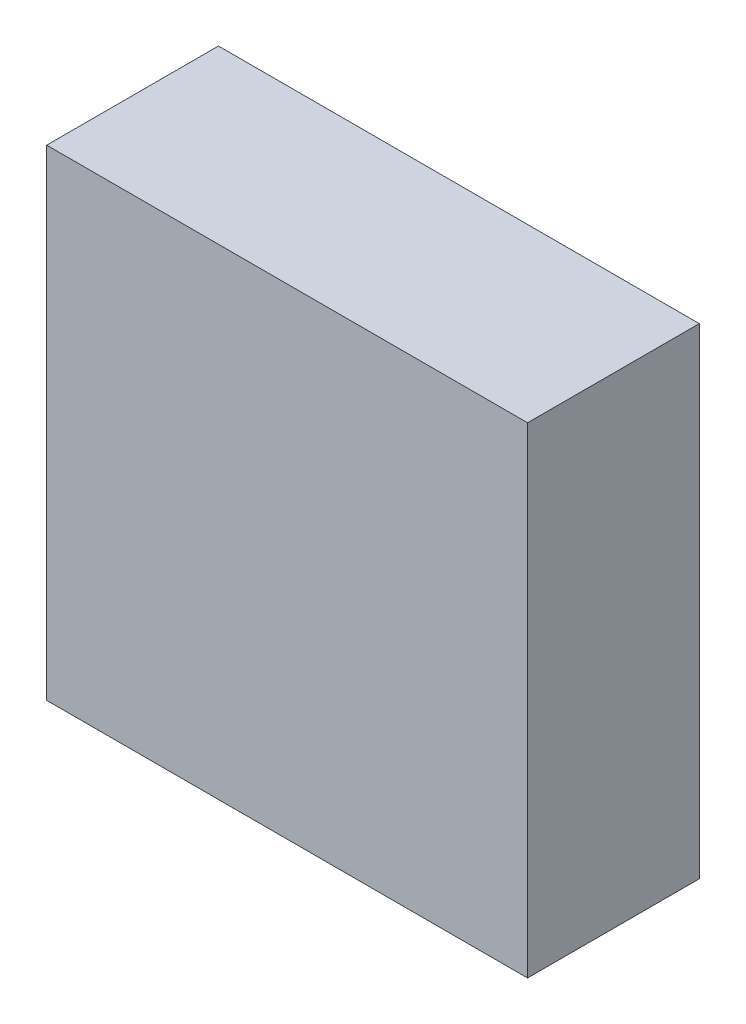
ISO-10303-21;
HEADER;
FILE_DESCRIPTION(('STEP AP214'),'2;1');
FILE_NAME('part.step','',(''),(''),'','','');
FILE_SCHEMA(('AUTOMOTIVE_DESIGN { 1 0 10303 214 1 1 1 1 }'));
ENDSEC;
DATA;
#1=APPLICATION_CONTEXT('core data for automotive mechanical design processes');
#2=APPLICATION_PROTOCOL_DEFINITION('international standard','automotive_design',2000,#1);
#3=PRODUCT_CONTEXT('',#1,'mechanical');
#4=PRODUCT('Part','Part','',(#3));
#5=PRODUCT_RELATED_PRODUCT_CATEGORY('part','',(#4));
#6=PRODUCT_DEFINITION_FORMATION('','',#4);
#7=PRODUCT_DEFINITION_CONTEXT('part definition',#1,'design');
#8=PRODUCT_DEFINITION('design','',#6,#7);
#9=PRODUCT_DEFINITION_SHAPE('','',#8);
#10=(LENGTH_UNIT() NAMED_UNIT(*) SI_UNIT(.MILLI.,.METRE.));
#11=(NAMED_UNIT(*) PLANE_ANGLE_UNIT() SI_UNIT($,.RADIAN.));
#12=(NAMED_UNIT(*) SI_UNIT($,.STERADIAN.) SOLID_ANGLE_UNIT());
#13=UNCERTAINTY_MEASURE_WITH_UNIT(LENGTH_MEASURE(1.E-05),#10,'distance_accuracy_value','');
#14=(GEOMETRIC_REPRESENTATION_CONTEXT(3) GLOBAL_UNCERTAINTY_ASSIGNED_CONTEXT((#13)) GLOBAL_UNIT_ASSIGNED_CONTEXT((#10,
#11,#12)) REPRESENTATION_CONTEXT('',''));
#15=CARTESIAN_POINT('',(0.,0.,0.));
#16=DIRECTION('',(0.,0.,1.));
#17=DIRECTION('',(1.,0.,0.));
#18=AXIS2_PLACEMENT_3D('',#15,#16,#17);
#19=CARTESIAN_POINT('',(35.,-35.,25.));
#20=DIRECTION('',(-1.,0.,0.));
#21=DIRECTION('',(0.,0.,1.));
#22=AXIS2_PLACEMENT_3D('',#19,#20,#21);
#23=PLANE('',#22);
#24=DIRECTION('',(0.,1.,0.));
#25=VECTOR('',#24,1.);
#26=CARTESIAN_POINT('',(35.,-35.,0.));
#27=LINE('',#26,#25);
#28=CARTESIAN_POINT('',(35.,-35.,0.));
#29=VERTEX_POINT('',#28);
#30=CARTESIAN_POINT('',(35.,35.,0.));
#31=VERTEX_POINT('',#30);
#32=EDGE_CURVE('E113',#29,#31,#27,.T.);
#33=ORIENTED_EDGE('',*,*,#32,.T.);
#34=DIRECTION('',(0.,0.,-1.));
#35=VECTOR('',#34,1.);
#36=CARTESIAN_POINT('',(35.,35.,25.));
#37=LINE('',#36,#35);
#38=CARTESIAN_POINT('',(35.,35.,25.));
#39=VERTEX_POINT('',#38);
#40=EDGE_CURVE('E11',#39,#31,#37,.T.);
#41=ORIENTED_EDGE('',*,*,#40,.F.);
#42=DIRECTION('',(0.,1.,0.));
#43=VECTOR('',#42,1.);
#44=CARTESIAN_POINT('',(35.,-35.,25.));
#45=LINE('',#44,#43);
#46=CARTESIAN_POINT('',(35.,-35.,25.));
#47=VERTEX_POINT('',#46);
#48=EDGE_CURVE('E97',#47,#39,#45,.T.);
#49=ORIENTED_EDGE('',*,*,#48,.F.);
#50=DIRECTION('',(0.,0.,-1.));
#51=VECTOR('',#50,1.);
#52=CARTESIAN_POINT('',(35.,-35.,25.));
#53=LINE('',#52,#51);
#54=EDGE_CURVE('E109',#47,#29,#53,.T.);
#55=ORIENTED_EDGE('',*,*,#54,.T.);
#56=EDGE_LOOP('',(#33,#41,#49,#55));
#57=FACE_BOUND('',#56,.T.);
#58=ADVANCED_FACE('F45',(#57),#23,.F.);
#59=CARTESIAN_POINT('',(-35.,35.,25.));
#60=DIRECTION('',(0.,-1.,0.));
#61=DIRECTION('',(0.,0.,-1.));
#62=AXIS2_PLACEMENT_3D('',#59,#60,#61);
#63=PLANE('',#62);
#64=DIRECTION('',(-1.,0.,0.));
#65=VECTOR('',#64,1.);
#66=CARTESIAN_POINT('',(-35.,35.,0.));
#67=LINE('',#66,#65);
#68=CARTESIAN_POINT('',(-35.,35.,0.));
#69=VERTEX_POINT('',#68);
#70=EDGE_CURVE('E102',#31,#69,#67,.T.);
#71=ORIENTED_EDGE('',*,*,#70,.T.);
#72=DIRECTION('',(0.,0.,-1.));
#73=VECTOR('',#72,1.);
#74=CARTESIAN_POINT('',(-35.,35.,25.));
#75=LINE('',#74,#73);
#76=CARTESIAN_POINT('',(-35.,35.,25.));
#77=VERTEX_POINT('',#76);
#78=EDGE_CURVE('E54',#77,#69,#75,.T.);
#79=ORIENTED_EDGE('',*,*,#78,.F.);
#80=DIRECTION('',(-1.,0.,0.));
#81=VECTOR('',#80,1.);
#82=CARTESIAN_POINT('',(-35.,35.,25.));
#83=LINE('',#82,#81);
#84=EDGE_CURVE('E92',#39,#77,#83,.T.);
#85=ORIENTED_EDGE('',*,*,#84,.F.);
#86=ORIENTED_EDGE('',*,*,#40,.T.);
#87=EDGE_LOOP('',(#71,#79,#85,#86));
#88=FACE_BOUND('',#87,.T.);
#89=ADVANCED_FACE('F101',(#88),#63,.F.);
#90=CARTESIAN_POINT('',(-35.,-35.,25.));
#91=DIRECTION('',(1.,0.,0.));
#92=DIRECTION('',(0.,0.,-1.));
#93=AXIS2_PLACEMENT_3D('',#90,#91,#92);
#94=PLANE('',#93);
#95=DIRECTION('',(0.,-1.,0.));
#96=VECTOR('',#95,1.);
#97=CARTESIAN_POINT('',(-35.,-35.,0.));
#98=LINE('',#97,#96);
#99=CARTESIAN_POINT('',(-35.,-35.,0.));
#100=VERTEX_POINT('',#99);
#101=EDGE_CURVE('E79',#69,#100,#98,.T.);
#102=ORIENTED_EDGE('',*,*,#101,.T.);
#103=DIRECTION('',(0.,0.,-1.));
#104=VECTOR('',#103,1.);
#105=CARTESIAN_POINT('',(-35.,-35.,25.));
#106=LINE('',#105,#104);
#107=CARTESIAN_POINT('',(-35.,-35.,25.));
#108=VERTEX_POINT('',#107);
#109=EDGE_CURVE('E104',#108,#100,#106,.T.);
#110=ORIENTED_EDGE('',*,*,#109,.F.);
#111=DIRECTION('',(0.,-1.,0.));
#112=VECTOR('',#111,1.);
#113=CARTESIAN_POINT('',(-35.,-35.,25.));
#114=LINE('',#113,#112);
#115=EDGE_CURVE('E95',#77,#108,#114,.T.);
#116=ORIENTED_EDGE('',*,*,#115,.F.);
#117=ORIENTED_EDGE('',*,*,#78,.T.);
#118=EDGE_LOOP('',(#102,#110,#116,#117));
#119=FACE_BOUND('',#118,.T.);
#120=ADVANCED_FACE('F105',(#119),#94,.F.);
#121=CARTESIAN_POINT('',(-35.,-35.,25.));
#122=DIRECTION('',(0.,1.,0.));
#123=DIRECTION('',(0.,0.,1.));
#124=AXIS2_PLACEMENT_3D('',#121,#122,#123);
#125=PLANE('',#124);
#126=DIRECTION('',(1.,0.,0.));
#127=VECTOR('',#126,1.);
#128=CARTESIAN_POINT('',(-35.,-35.,0.));
#129=LINE('',#128,#127);
#130=EDGE_CURVE('E85',#100,#29,#129,.T.);
#131=ORIENTED_EDGE('',*,*,#130,.T.);
#132=ORIENTED_EDGE('',*,*,#54,.F.);
#133=DIRECTION('',(1.,0.,0.));
#134=VECTOR('',#133,1.);
#135=CARTESIAN_POINT('',(-35.,-35.,25.));
#136=LINE('',#135,#134);
#137=EDGE_CURVE('E62',#108,#47,#136,.T.);
#138=ORIENTED_EDGE('',*,*,#137,.F.);
#139=ORIENTED_EDGE('',*,*,#109,.T.);
#140=EDGE_LOOP('',(#131,#132,#138,#139));
#141=FACE_BOUND('',#140,.T.);
#142=ADVANCED_FACE('F126',(#141),#125,.F.);
#143=CARTESIAN_POINT('',(0.,0.,25.));
#144=DIRECTION('',(0.,0.,-1.));
#145=DIRECTION('',(-1.,0.,0.));
#146=AXIS2_PLACEMENT_3D('',#143,#144,#145);
#147=PLANE('',#146);
#148=ORIENTED_EDGE('',*,*,#48,.T.);
#149=ORIENTED_EDGE('',*,*,#84,.T.);
#150=ORIENTED_EDGE('',*,*,#115,.T.);
#151=ORIENTED_EDGE('',*,*,#137,.T.);
#152=EDGE_LOOP('',(#148,#149,#150,#151));
#153=FACE_BOUND('',#152,.T.);
#154=ADVANCED_FACE('F93',(#153),#147,.F.);
#155=CARTESIAN_POINT('',(0.,0.,0.));
#156=DIRECTION('',(0.,0.,-1.));
#157=DIRECTION('',(-1.,0.,0.));
#158=AXIS2_PLACEMENT_3D('',#155,#156,#157);
#159=PLANE('',#158);
#160=ORIENTED_EDGE('',*,*,#32,.F.);
#161=ORIENTED_EDGE('',*,*,#130,.F.);
#162=ORIENTED_EDGE('',*,*,#101,.F.);
#163=ORIENTED_EDGE('',*,*,#70,.F.);
#164=EDGE_LOOP('',(#160,#161,#162,#163));
#165=FACE_BOUND('',#164,.T.);
#166=ADVANCED_FACE('F129',(#165),#159,.T.);
#167=CLOSED_SHELL('',(#58,#89,#120,#142,#154,#166));
#168=MANIFOLD_SOLID_BREP('B2',#167);
#169=ADVANCED_BREP_SHAPE_REPRESENTATION('',(#18,#168),#14);
#170=SHAPE_DEFINITION_REPRESENTATION(#9,#169);
ENDSEC;
END-ISO-10303-21;
